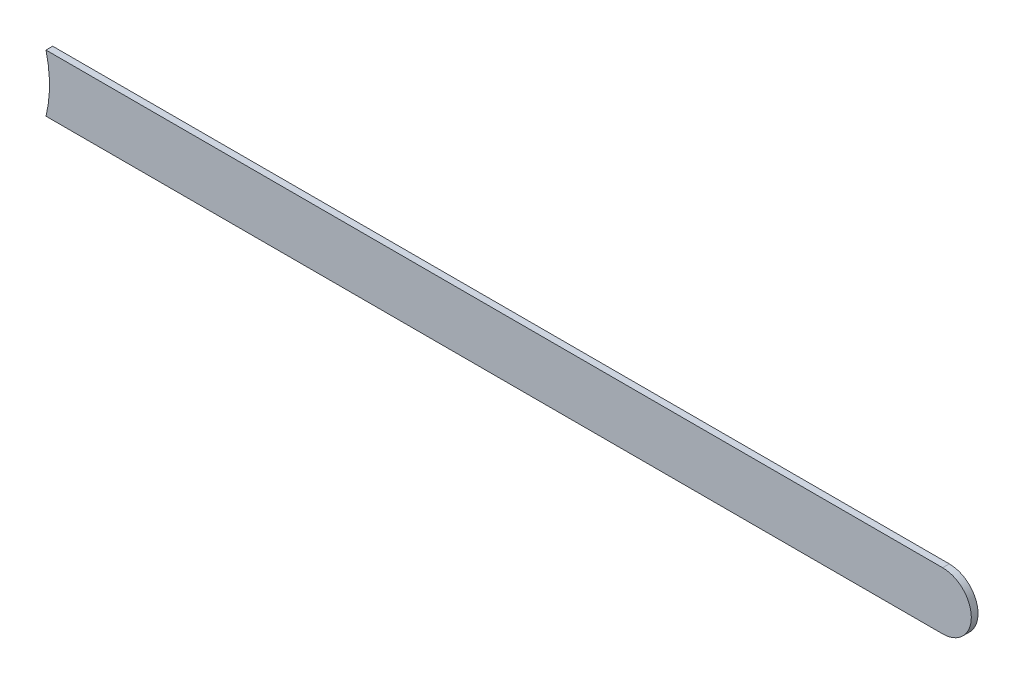
ISO-10303-21;
HEADER;
FILE_DESCRIPTION(('STEP AP214'),'2;1');
FILE_NAME('part.step','',(''),(''),'','','');
FILE_SCHEMA(('AUTOMOTIVE_DESIGN { 1 0 10303 214 1 1 1 1 }'));
ENDSEC;
DATA;
#1=APPLICATION_CONTEXT('core data for automotive mechanical design processes');
#2=APPLICATION_PROTOCOL_DEFINITION('international standard','automotive_design',2000,#1);
#3=PRODUCT_CONTEXT('',#1,'mechanical');
#4=PRODUCT('Part','Part','',(#3));
#5=PRODUCT_RELATED_PRODUCT_CATEGORY('part','',(#4));
#6=PRODUCT_DEFINITION_FORMATION('','',#4);
#7=PRODUCT_DEFINITION_CONTEXT('part definition',#1,'design');
#8=PRODUCT_DEFINITION('design','',#6,#7);
#9=PRODUCT_DEFINITION_SHAPE('','',#8);
#10=(LENGTH_UNIT() NAMED_UNIT(*) SI_UNIT(.MILLI.,.METRE.));
#11=(NAMED_UNIT(*) PLANE_ANGLE_UNIT() SI_UNIT($,.RADIAN.));
#12=(NAMED_UNIT(*) SI_UNIT($,.STERADIAN.) SOLID_ANGLE_UNIT());
#13=UNCERTAINTY_MEASURE_WITH_UNIT(LENGTH_MEASURE(1.E-05),#10,'distance_accuracy_value','');
#14=(GEOMETRIC_REPRESENTATION_CONTEXT(3) GLOBAL_UNCERTAINTY_ASSIGNED_CONTEXT((#13)) GLOBAL_UNIT_ASSIGNED_CONTEXT((#10,
#11,#12)) REPRESENTATION_CONTEXT('',''));
#15=CARTESIAN_POINT('',(0.,0.,0.));
#16=DIRECTION('',(0.,0.,1.));
#17=DIRECTION('',(1.,0.,0.));
#18=AXIS2_PLACEMENT_3D('',#15,#16,#17);
#19=CARTESIAN_POINT('',(85.29,-74.44,1.6));
#20=DIRECTION('',(0.,-1.,0.));
#21=DIRECTION('',(0.,0.,-1.));
#22=AXIS2_PLACEMENT_3D('',#19,#20,#21);
#23=PLANE('',#22);
#24=DIRECTION('',(0.,0.,-1.));
#25=VECTOR('',#24,1.);
#26=CARTESIAN_POINT('',(80.596733054976,-74.44,-0.045));
#27=LINE('',#26,#25);
#28=CARTESIAN_POINT('',(80.596733054976,-74.44,1.635));
#29=VERTEX_POINT('',#28);
#30=CARTESIAN_POINT('',(80.596733054976,-74.44,1.6));
#31=VERTEX_POINT('',#30);
#32=EDGE_CURVE('E11',#29,#31,#27,.T.);
#33=ORIENTED_EDGE('',*,*,#32,.F.);
#34=DIRECTION('',(-1.,0.,0.));
#35=VECTOR('',#34,1.);
#36=CARTESIAN_POINT('',(85.29,-74.44,1.635));
#37=LINE('',#36,#35);
#38=CARTESIAN_POINT('',(85.29,-74.44,1.635));
#39=VERTEX_POINT('',#38);
#40=EDGE_CURVE('E27',#39,#29,#37,.T.);
#41=ORIENTED_EDGE('',*,*,#40,.F.);
#42=DIRECTION('',(0.,0.,1.));
#43=VECTOR('',#42,1.);
#44=CARTESIAN_POINT('',(85.29,-74.44,1.6));
#45=LINE('',#44,#43);
#46=CARTESIAN_POINT('',(85.29,-74.44,1.6));
#47=VERTEX_POINT('',#46);
#48=EDGE_CURVE('E108',#47,#39,#45,.T.);
#49=ORIENTED_EDGE('',*,*,#48,.F.);
#50=DIRECTION('',(-1.,0.,0.));
#51=VECTOR('',#50,1.);
#52=CARTESIAN_POINT('',(85.29,-74.44,1.6));
#53=LINE('',#52,#51);
#54=EDGE_CURVE('E101',#47,#31,#53,.T.);
#55=ORIENTED_EDGE('',*,*,#54,.T.);
#56=EDGE_LOOP('',(#33,#41,#49,#55));
#57=FACE_BOUND('',#56,.T.);
#58=ADVANCED_FACE('F17',(#57),#23,.F.);
#59=CARTESIAN_POINT('',(79.99,-74.59,-0.045));
#60=DIRECTION('',(0.,0.,-1.));
#61=DIRECTION('',(0.,-1.,0.));
#62=AXIS2_PLACEMENT_3D('',#59,#60,#61);
#63=CYLINDRICAL_SURFACE('',#62,0.625);
#64=DIRECTION('',(0.,0.,-1.));
#65=VECTOR('',#64,1.);
#66=CARTESIAN_POINT('',(80.596733054976,-74.74,-0.045));
#67=LINE('',#66,#65);
#68=CARTESIAN_POINT('',(80.596733054973,-74.74,1.635));
#69=VERTEX_POINT('',#68);
#70=CARTESIAN_POINT('',(80.596733054973,-74.74,1.6));
#71=VERTEX_POINT('',#70);
#72=EDGE_CURVE('E80',#69,#71,#67,.T.);
#73=ORIENTED_EDGE('',*,*,#72,.F.);
#74=CARTESIAN_POINT('',(79.99,-74.59,1.635));
#75=DIRECTION('',(0.,0.,-1.));
#76=DIRECTION('',(0.,-1.,0.));
#77=AXIS2_PLACEMENT_3D('',#74,#75,#76);
#78=CIRCLE('',#77,0.625);
#79=EDGE_CURVE('E70',#29,#69,#78,.T.);
#80=ORIENTED_EDGE('',*,*,#79,.F.);
#81=ORIENTED_EDGE('',*,*,#32,.T.);
#82=CARTESIAN_POINT('',(79.99,-74.59,1.6));
#83=DIRECTION('',(0.,0.,-1.));
#84=DIRECTION('',(0.,-1.,0.));
#85=AXIS2_PLACEMENT_3D('',#82,#83,#84);
#86=CIRCLE('',#85,0.625);
#87=EDGE_CURVE('E82',#31,#71,#86,.T.);
#88=ORIENTED_EDGE('',*,*,#87,.T.);
#89=EDGE_LOOP('',(#73,#80,#81,#88));
#90=FACE_BOUND('',#89,.T.);
#91=ADVANCED_FACE('F19',(#90),#63,.F.);
#92=CARTESIAN_POINT('',(79.99,-74.74,1.635));
#93=DIRECTION('',(0.,0.,1.));
#94=DIRECTION('',(1.,0.,0.));
#95=AXIS2_PLACEMENT_3D('',#92,#93,#94);
#96=PLANE('',#95);
#97=ORIENTED_EDGE('',*,*,#79,.T.);
#98=DIRECTION('',(1.,0.,0.));
#99=VECTOR('',#98,1.);
#100=CARTESIAN_POINT('',(79.99,-74.74,1.635));
#101=LINE('',#100,#99);
#102=CARTESIAN_POINT('',(85.29,-74.74,1.635));
#103=VERTEX_POINT('',#102);
#104=EDGE_CURVE('E74',#69,#103,#101,.T.);
#105=ORIENTED_EDGE('',*,*,#104,.T.);
#106=CARTESIAN_POINT('',(85.29,-74.59,1.635));
#107=DIRECTION('',(0.,0.,1.));
#108=DIRECTION('',(0.,-1.,0.));
#109=AXIS2_PLACEMENT_3D('',#106,#107,#108);
#110=CIRCLE('',#109,0.15);
#111=EDGE_CURVE('E21',#103,#39,#110,.T.);
#112=ORIENTED_EDGE('',*,*,#111,.T.);
#113=ORIENTED_EDGE('',*,*,#40,.T.);
#114=EDGE_LOOP('',(#97,#105,#112,#113));
#115=FACE_BOUND('',#114,.T.);
#116=ADVANCED_FACE('F72',(#115),#96,.T.);
#117=CARTESIAN_POINT('',(85.29,-74.59,1.6));
#118=DIRECTION('',(0.,0.,-1.));
#119=DIRECTION('',(0.,-1.,0.));
#120=AXIS2_PLACEMENT_3D('',#117,#118,#119);
#121=CYLINDRICAL_SURFACE('',#120,0.15);
#122=CARTESIAN_POINT('',(85.29,-74.59,1.6));
#123=DIRECTION('',(0.,0.,1.));
#124=DIRECTION('',(0.,-1.,0.));
#125=AXIS2_PLACEMENT_3D('',#122,#123,#124);
#126=CIRCLE('',#125,0.15);
#127=CARTESIAN_POINT('',(85.29,-74.74,1.6));
#128=VERTEX_POINT('',#127);
#129=EDGE_CURVE('E105',#128,#47,#126,.T.);
#130=ORIENTED_EDGE('',*,*,#129,.T.);
#131=ORIENTED_EDGE('',*,*,#48,.T.);
#132=ORIENTED_EDGE('',*,*,#111,.F.);
#133=DIRECTION('',(0.,0.,1.));
#134=VECTOR('',#133,1.);
#135=CARTESIAN_POINT('',(85.29,-74.74,1.6));
#136=LINE('',#135,#134);
#137=EDGE_CURVE('E91',#128,#103,#136,.T.);
#138=ORIENTED_EDGE('',*,*,#137,.F.);
#139=EDGE_LOOP('',(#130,#131,#132,#138));
#140=FACE_BOUND('',#139,.T.);
#141=ADVANCED_FACE('F174',(#140),#121,.T.);
#142=CARTESIAN_POINT('',(79.99,-74.74,1.6));
#143=DIRECTION('',(0.,0.,1.));
#144=DIRECTION('',(1.,0.,0.));
#145=AXIS2_PLACEMENT_3D('',#142,#143,#144);
#146=PLANE('',#145);
#147=ORIENTED_EDGE('',*,*,#54,.F.);
#148=ORIENTED_EDGE('',*,*,#129,.F.);
#149=DIRECTION('',(1.,0.,0.));
#150=VECTOR('',#149,1.);
#151=CARTESIAN_POINT('',(79.99,-74.74,1.6));
#152=LINE('',#151,#150);
#153=EDGE_CURVE('E87',#71,#128,#152,.T.);
#154=ORIENTED_EDGE('',*,*,#153,.F.);
#155=ORIENTED_EDGE('',*,*,#87,.F.);
#156=EDGE_LOOP('',(#147,#148,#154,#155));
#157=FACE_BOUND('',#156,.T.);
#158=ADVANCED_FACE('F166',(#157),#146,.F.);
#159=CARTESIAN_POINT('',(79.99,-74.74,1.6));
#160=DIRECTION('',(0.,1.,0.));
#161=DIRECTION('',(1.,0.,0.));
#162=AXIS2_PLACEMENT_3D('',#159,#160,#161);
#163=PLANE('',#162);
#164=ORIENTED_EDGE('',*,*,#137,.T.);
#165=ORIENTED_EDGE('',*,*,#104,.F.);
#166=ORIENTED_EDGE('',*,*,#72,.T.);
#167=ORIENTED_EDGE('',*,*,#153,.T.);
#168=EDGE_LOOP('',(#164,#165,#166,#167));
#169=FACE_BOUND('',#168,.T.);
#170=ADVANCED_FACE('F89',(#169),#163,.F.);
#171=CLOSED_SHELL('',(#58,#91,#116,#141,#158,#170));
#172=MANIFOLD_SOLID_BREP('B1',#171);
#173=ADVANCED_BREP_SHAPE_REPRESENTATION('',(#18,#172),#14);
#174=SHAPE_DEFINITION_REPRESENTATION(#9,#173);
ENDSEC;
END-ISO-10303-21;
